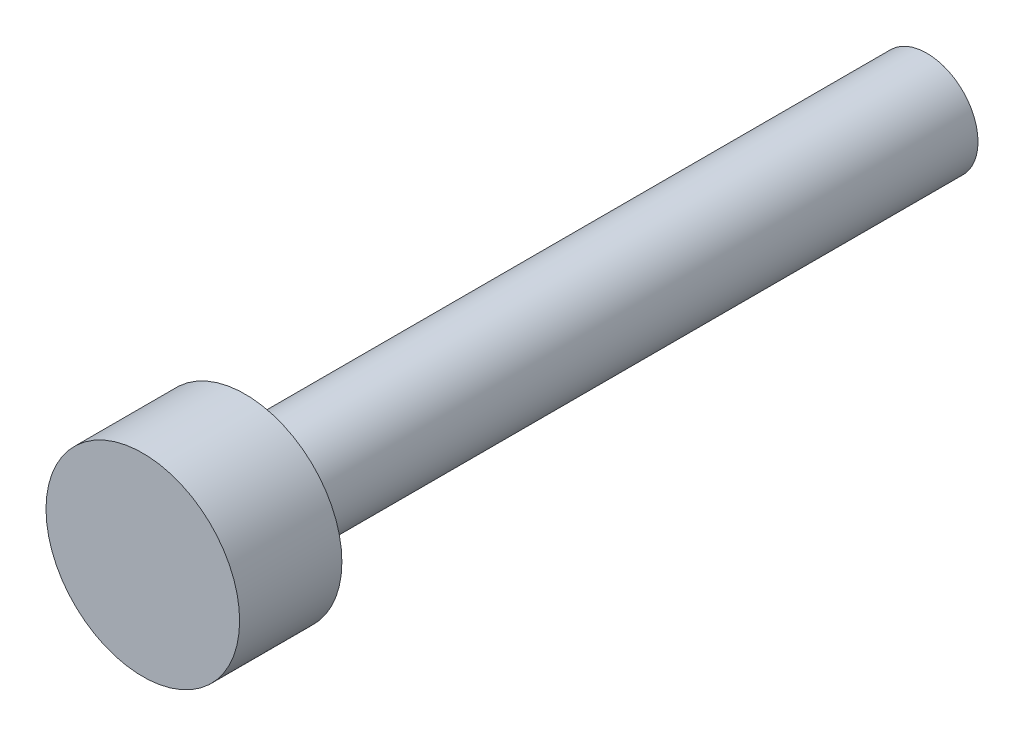
ISO-10303-21;
HEADER;
FILE_DESCRIPTION(('STEP AP214'),'2;1');
FILE_NAME('part.step','',(''),(''),'','','');
FILE_SCHEMA(('AUTOMOTIVE_DESIGN { 1 0 10303 214 1 1 1 1 }'));
ENDSEC;
DATA;
#1=APPLICATION_CONTEXT('core data for automotive mechanical design processes');
#2=APPLICATION_PROTOCOL_DEFINITION('international standard','automotive_design',2000,#1);
#3=PRODUCT_CONTEXT('',#1,'mechanical');
#4=PRODUCT('Part','Part','',(#3));
#5=PRODUCT_RELATED_PRODUCT_CATEGORY('part','',(#4));
#6=PRODUCT_DEFINITION_FORMATION('','',#4);
#7=PRODUCT_DEFINITION_CONTEXT('part definition',#1,'design');
#8=PRODUCT_DEFINITION('design','',#6,#7);
#9=PRODUCT_DEFINITION_SHAPE('','',#8);
#10=(LENGTH_UNIT() NAMED_UNIT(*) SI_UNIT(.MILLI.,.METRE.));
#11=(NAMED_UNIT(*) PLANE_ANGLE_UNIT() SI_UNIT($,.RADIAN.));
#12=(NAMED_UNIT(*) SI_UNIT($,.STERADIAN.) SOLID_ANGLE_UNIT());
#13=UNCERTAINTY_MEASURE_WITH_UNIT(LENGTH_MEASURE(1.E-05),#10,'distance_accuracy_value','');
#14=(GEOMETRIC_REPRESENTATION_CONTEXT(3) GLOBAL_UNCERTAINTY_ASSIGNED_CONTEXT((#13)) GLOBAL_UNIT_ASSIGNED_CONTEXT((#10,
#11,#12)) REPRESENTATION_CONTEXT('',''));
#15=CARTESIAN_POINT('',(0.,0.,0.));
#16=DIRECTION('',(0.,0.,1.));
#17=DIRECTION('',(1.,0.,0.));
#18=AXIS2_PLACEMENT_3D('',#15,#16,#17);
#19=CARTESIAN_POINT('',(0.,0.,20.));
#20=DIRECTION('',(0.,0.,-1.));
#21=DIRECTION('',(-1.,0.,0.));
#22=AXIS2_PLACEMENT_3D('',#19,#20,#21);
#23=CYLINDRICAL_SURFACE('',#22,1.5);
#24=CARTESIAN_POINT('',(0.,0.,20.));
#25=DIRECTION('',(0.,0.,1.));
#26=DIRECTION('',(1.,0.,0.));
#27=AXIS2_PLACEMENT_3D('',#24,#25,#26);
#28=CIRCLE('',#27,1.5);
#29=CARTESIAN_POINT('',(1.5,0.,20.));
#30=VERTEX_POINT('',#29);
#31=EDGE_CURVE('E10',#30,#30,#28,.T.);
#32=ORIENTED_EDGE('',*,*,#31,.F.);
#33=EDGE_LOOP('',(#32));
#34=FACE_BOUND('',#33,.T.);
#35=CARTESIAN_POINT('',(0.,0.,0.));
#36=DIRECTION('',(0.,0.,1.));
#37=DIRECTION('',(1.,0.,0.));
#38=AXIS2_PLACEMENT_3D('',#35,#36,#37);
#39=CIRCLE('',#38,1.5);
#40=CARTESIAN_POINT('',(1.5,0.,0.));
#41=VERTEX_POINT('',#40);
#42=EDGE_CURVE('E46',#41,#41,#39,.T.);
#43=ORIENTED_EDGE('',*,*,#42,.T.);
#44=EDGE_LOOP('',(#43));
#45=FACE_BOUND('',#44,.T.);
#46=ADVANCED_FACE('F43',(#34,#45),#23,.T.);
#47=CARTESIAN_POINT('',(0.,0.,0.));
#48=DIRECTION('',(0.,0.,1.));
#49=DIRECTION('',(1.,0.,0.));
#50=AXIS2_PLACEMENT_3D('',#47,#48,#49);
#51=PLANE('',#50);
#52=ORIENTED_EDGE('',*,*,#42,.F.);
#53=EDGE_LOOP('',(#52));
#54=FACE_BOUND('',#53,.T.);
#55=ADVANCED_FACE('F70',(#54),#51,.F.);
#56=CARTESIAN_POINT('',(0.,0.,23.));
#57=DIRECTION('',(0.,0.,-1.));
#58=DIRECTION('',(-1.,0.,0.));
#59=AXIS2_PLACEMENT_3D('',#56,#57,#58);
#60=CYLINDRICAL_SURFACE('',#59,2.84);
#61=CARTESIAN_POINT('',(0.,0.,23.));
#62=DIRECTION('',(0.,0.,1.));
#63=DIRECTION('',(1.,0.,0.));
#64=AXIS2_PLACEMENT_3D('',#61,#62,#63);
#65=CIRCLE('',#64,2.84);
#66=CARTESIAN_POINT('',(2.84,0.,23.));
#67=VERTEX_POINT('',#66);
#68=EDGE_CURVE('E55',#67,#67,#65,.T.);
#69=ORIENTED_EDGE('',*,*,#68,.F.);
#70=EDGE_LOOP('',(#69));
#71=FACE_BOUND('',#70,.T.);
#72=CARTESIAN_POINT('',(0.,0.,20.));
#73=DIRECTION('',(0.,0.,1.));
#74=DIRECTION('',(1.,0.,0.));
#75=AXIS2_PLACEMENT_3D('',#72,#73,#74);
#76=CIRCLE('',#75,2.84);
#77=CARTESIAN_POINT('',(2.84,0.,20.));
#78=VERTEX_POINT('',#77);
#79=EDGE_CURVE('E57',#78,#78,#76,.T.);
#80=ORIENTED_EDGE('',*,*,#79,.T.);
#81=EDGE_LOOP('',(#80));
#82=FACE_BOUND('',#81,.T.);
#83=ADVANCED_FACE('F67',(#71,#82),#60,.T.);
#84=CARTESIAN_POINT('',(0.,0.,23.));
#85=DIRECTION('',(0.,0.,1.));
#86=DIRECTION('',(1.,0.,0.));
#87=AXIS2_PLACEMENT_3D('',#84,#85,#86);
#88=PLANE('',#87);
#89=ORIENTED_EDGE('',*,*,#68,.T.);
#90=EDGE_LOOP('',(#89));
#91=FACE_BOUND('',#90,.T.);
#92=ADVANCED_FACE('F65',(#91),#88,.T.);
#93=CARTESIAN_POINT('',(0.,0.,20.));
#94=DIRECTION('',(0.,0.,1.));
#95=DIRECTION('',(1.,0.,0.));
#96=AXIS2_PLACEMENT_3D('',#93,#94,#95);
#97=PLANE('',#96);
#98=ORIENTED_EDGE('',*,*,#31,.T.);
#99=EDGE_LOOP('',(#98));
#100=FACE_BOUND('',#99,.T.);
#101=ORIENTED_EDGE('',*,*,#79,.F.);
#102=EDGE_LOOP('',(#101));
#103=FACE_BOUND('',#102,.T.);
#104=ADVANCED_FACE('F74',(#100,#103),#97,.F.);
#105=CLOSED_SHELL('',(#46,#55,#83,#92,#104));
#106=MANIFOLD_SOLID_BREP('B2',#105);
#107=ADVANCED_BREP_SHAPE_REPRESENTATION('',(#18,#106),#14);
#108=SHAPE_DEFINITION_REPRESENTATION(#9,#107);
ENDSEC;
END-ISO-10303-21;
